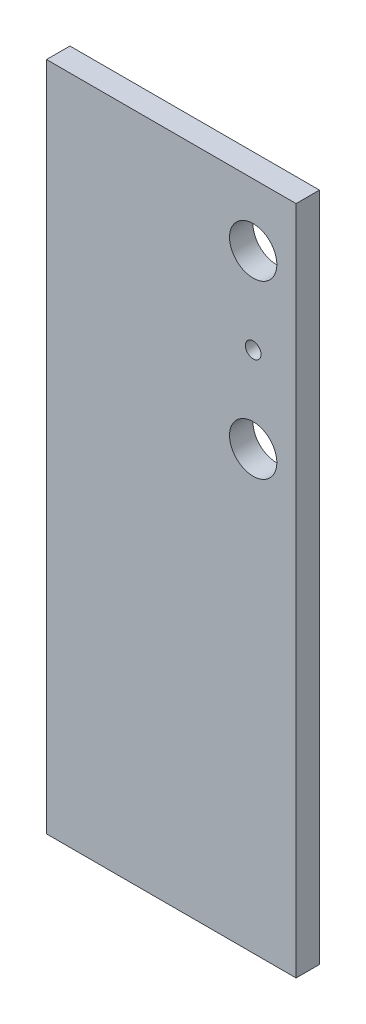
ISO-10303-21;
HEADER;
FILE_DESCRIPTION(('STEP AP214'),'2;1');
FILE_NAME('part.step','',(''),(''),'','','');
FILE_SCHEMA(('AUTOMOTIVE_DESIGN { 1 0 10303 214 1 1 1 1 }'));
ENDSEC;
DATA;
#1=APPLICATION_CONTEXT('core data for automotive mechanical design processes');
#2=APPLICATION_PROTOCOL_DEFINITION('international standard','automotive_design',2000,#1);
#3=PRODUCT_CONTEXT('',#1,'mechanical');
#4=PRODUCT('Part','Part','',(#3));
#5=PRODUCT_RELATED_PRODUCT_CATEGORY('part','',(#4));
#6=PRODUCT_DEFINITION_FORMATION('','',#4);
#7=PRODUCT_DEFINITION_CONTEXT('part definition',#1,'design');
#8=PRODUCT_DEFINITION('design','',#6,#7);
#9=PRODUCT_DEFINITION_SHAPE('','',#8);
#10=(LENGTH_UNIT() NAMED_UNIT(*) SI_UNIT(.MILLI.,.METRE.));
#11=(NAMED_UNIT(*) PLANE_ANGLE_UNIT() SI_UNIT($,.RADIAN.));
#12=(NAMED_UNIT(*) SI_UNIT($,.STERADIAN.) SOLID_ANGLE_UNIT());
#13=UNCERTAINTY_MEASURE_WITH_UNIT(LENGTH_MEASURE(1.E-05),#10,'distance_accuracy_value','');
#14=(GEOMETRIC_REPRESENTATION_CONTEXT(3) GLOBAL_UNCERTAINTY_ASSIGNED_CONTEXT((#13)) GLOBAL_UNIT_ASSIGNED_CONTEXT((#10,
#11,#12)) REPRESENTATION_CONTEXT('',''));
#15=CARTESIAN_POINT('',(0.,0.,0.));
#16=DIRECTION('',(0.,0.,1.));
#17=DIRECTION('',(1.,0.,0.));
#18=AXIS2_PLACEMENT_3D('',#15,#16,#17);
#19=CARTESIAN_POINT('',(0.,0.,19.05));
#20=DIRECTION('',(1.,0.,0.));
#21=DIRECTION('',(0.,0.,-1.));
#22=AXIS2_PLACEMENT_3D('',#19,#20,#21);
#23=PLANE('',#22);
#24=DIRECTION('',(0.,-1.,0.));
#25=VECTOR('',#24,1.);
#26=CARTESIAN_POINT('',(0.,0.,0.));
#27=LINE('',#26,#25);
#28=CARTESIAN_POINT('',(0.,546.1,0.));
#29=VERTEX_POINT('',#28);
#30=CARTESIAN_POINT('',(0.,0.,0.));
#31=VERTEX_POINT('',#30);
#32=EDGE_CURVE('E95',#29,#31,#27,.T.);
#33=ORIENTED_EDGE('',*,*,#32,.T.);
#34=DIRECTION('',(0.,0.,-1.));
#35=VECTOR('',#34,1.);
#36=CARTESIAN_POINT('',(0.,0.,19.05));
#37=LINE('',#36,#35);
#38=CARTESIAN_POINT('',(0.,0.,19.05));
#39=VERTEX_POINT('',#38);
#40=EDGE_CURVE('E11',#39,#31,#37,.T.);
#41=ORIENTED_EDGE('',*,*,#40,.F.);
#42=DIRECTION('',(0.,-1.,0.));
#43=VECTOR('',#42,1.);
#44=CARTESIAN_POINT('',(0.,0.,19.05));
#45=LINE('',#44,#43);
#46=CARTESIAN_POINT('',(0.,546.1,19.05));
#47=VERTEX_POINT('',#46);
#48=EDGE_CURVE('E83',#47,#39,#45,.T.);
#49=ORIENTED_EDGE('',*,*,#48,.F.);
#50=DIRECTION('',(0.,0.,-1.));
#51=VECTOR('',#50,1.);
#52=CARTESIAN_POINT('',(0.,546.1,19.05));
#53=LINE('',#52,#51);
#54=EDGE_CURVE('E91',#47,#29,#53,.T.);
#55=ORIENTED_EDGE('',*,*,#54,.T.);
#56=EDGE_LOOP('',(#33,#41,#49,#55));
#57=FACE_BOUND('',#56,.T.);
#58=ADVANCED_FACE('F32',(#57),#23,.F.);
#59=CARTESIAN_POINT('',(0.,0.,19.05));
#60=DIRECTION('',(0.,1.,0.));
#61=DIRECTION('',(0.,0.,1.));
#62=AXIS2_PLACEMENT_3D('',#59,#60,#61);
#63=PLANE('',#62);
#64=DIRECTION('',(1.,0.,0.));
#65=VECTOR('',#64,1.);
#66=CARTESIAN_POINT('',(0.,0.,0.));
#67=LINE('',#66,#65);
#68=CARTESIAN_POINT('',(203.2,0.,0.));
#69=VERTEX_POINT('',#68);
#70=EDGE_CURVE('E87',#31,#69,#67,.T.);
#71=ORIENTED_EDGE('',*,*,#70,.T.);
#72=DIRECTION('',(0.,0.,-1.));
#73=VECTOR('',#72,1.);
#74=CARTESIAN_POINT('',(203.2,0.,19.05));
#75=LINE('',#74,#73);
#76=CARTESIAN_POINT('',(203.2,0.,19.05));
#77=VERTEX_POINT('',#76);
#78=EDGE_CURVE('E40',#77,#69,#75,.T.);
#79=ORIENTED_EDGE('',*,*,#78,.F.);
#80=DIRECTION('',(1.,0.,0.));
#81=VECTOR('',#80,1.);
#82=CARTESIAN_POINT('',(0.,0.,19.05));
#83=LINE('',#82,#81);
#84=EDGE_CURVE('E78',#39,#77,#83,.T.);
#85=ORIENTED_EDGE('',*,*,#84,.F.);
#86=ORIENTED_EDGE('',*,*,#40,.T.);
#87=EDGE_LOOP('',(#71,#79,#85,#86));
#88=FACE_BOUND('',#87,.T.);
#89=ADVANCED_FACE('F86',(#88),#63,.F.);
#90=CARTESIAN_POINT('',(203.2,0.,19.05));
#91=DIRECTION('',(-1.,0.,0.));
#92=DIRECTION('',(0.,0.,1.));
#93=AXIS2_PLACEMENT_3D('',#90,#91,#92);
#94=PLANE('',#93);
#95=DIRECTION('',(0.,1.,0.));
#96=VECTOR('',#95,1.);
#97=CARTESIAN_POINT('',(203.2,0.,0.));
#98=LINE('',#97,#96);
#99=CARTESIAN_POINT('',(203.2,546.1,0.));
#100=VERTEX_POINT('',#99);
#101=EDGE_CURVE('E65',#69,#100,#98,.T.);
#102=ORIENTED_EDGE('',*,*,#101,.T.);
#103=DIRECTION('',(0.,0.,-1.));
#104=VECTOR('',#103,1.);
#105=CARTESIAN_POINT('',(203.2,546.1,19.05));
#106=LINE('',#105,#104);
#107=CARTESIAN_POINT('',(203.2,546.1,19.05));
#108=VERTEX_POINT('',#107);
#109=EDGE_CURVE('E88',#108,#100,#106,.T.);
#110=ORIENTED_EDGE('',*,*,#109,.F.);
#111=DIRECTION('',(0.,1.,0.));
#112=VECTOR('',#111,1.);
#113=CARTESIAN_POINT('',(203.2,0.,19.05));
#114=LINE('',#113,#112);
#115=EDGE_CURVE('E81',#77,#108,#114,.T.);
#116=ORIENTED_EDGE('',*,*,#115,.F.);
#117=ORIENTED_EDGE('',*,*,#78,.T.);
#118=EDGE_LOOP('',(#102,#110,#116,#117));
#119=FACE_BOUND('',#118,.T.);
#120=ADVANCED_FACE('F89',(#119),#94,.F.);
#121=CARTESIAN_POINT('',(0.,546.1,19.05));
#122=DIRECTION('',(0.,-1.,0.));
#123=DIRECTION('',(0.,0.,-1.));
#124=AXIS2_PLACEMENT_3D('',#121,#122,#123);
#125=PLANE('',#124);
#126=DIRECTION('',(-1.,0.,0.));
#127=VECTOR('',#126,1.);
#128=CARTESIAN_POINT('',(0.,546.1,0.));
#129=LINE('',#128,#127);
#130=EDGE_CURVE('E71',#100,#29,#129,.T.);
#131=ORIENTED_EDGE('',*,*,#130,.T.);
#132=ORIENTED_EDGE('',*,*,#54,.F.);
#133=DIRECTION('',(-1.,0.,0.));
#134=VECTOR('',#133,1.);
#135=CARTESIAN_POINT('',(0.,546.1,19.05));
#136=LINE('',#135,#134);
#137=EDGE_CURVE('E48',#108,#47,#136,.T.);
#138=ORIENTED_EDGE('',*,*,#137,.F.);
#139=ORIENTED_EDGE('',*,*,#109,.T.);
#140=EDGE_LOOP('',(#131,#132,#138,#139));
#141=FACE_BOUND('',#140,.T.);
#142=ADVANCED_FACE('F103',(#141),#125,.F.);
#143=CARTESIAN_POINT('',(0.,546.1,19.05));
#144=DIRECTION('',(0.,0.,-1.));
#145=DIRECTION('',(-1.,0.,0.));
#146=AXIS2_PLACEMENT_3D('',#143,#144,#145);
#147=PLANE('',#146);
#148=CARTESIAN_POINT('',(168.275,425.45,19.05));
#149=DIRECTION('',(0.,0.,-1.));
#150=DIRECTION('',(-1.,0.,0.));
#151=AXIS2_PLACEMENT_3D('',#148,#149,#150);
#152=CIRCLE('',#151,6.34999999999999);
#153=CARTESIAN_POINT('',(161.925,425.45,19.05));
#154=VERTEX_POINT('',#153);
#155=EDGE_CURVE('E124',#154,#154,#152,.T.);
#156=ORIENTED_EDGE('',*,*,#155,.T.);
#157=EDGE_LOOP('',(#156));
#158=FACE_BOUND('',#157,.T.);
#159=CARTESIAN_POINT('',(168.275,355.6,19.05));
#160=DIRECTION('',(0.,0.,-1.));
#161=DIRECTION('',(-1.,0.,0.));
#162=AXIS2_PLACEMENT_3D('',#159,#160,#161);
#163=CIRCLE('',#162,19.2405);
#164=CARTESIAN_POINT('',(149.0345,355.6,19.05));
#165=VERTEX_POINT('',#164);
#166=EDGE_CURVE('E112',#165,#165,#163,.T.);
#167=ORIENTED_EDGE('',*,*,#166,.T.);
#168=EDGE_LOOP('',(#167));
#169=FACE_BOUND('',#168,.T.);
#170=CARTESIAN_POINT('',(168.275,495.3,19.05));
#171=DIRECTION('',(0.,0.,-1.));
#172=DIRECTION('',(-1.,0.,0.));
#173=AXIS2_PLACEMENT_3D('',#170,#171,#172);
#174=CIRCLE('',#173,19.2405);
#175=CARTESIAN_POINT('',(149.0345,495.3,19.05));
#176=VERTEX_POINT('',#175);
#177=EDGE_CURVE('E98',#176,#176,#174,.T.);
#178=ORIENTED_EDGE('',*,*,#177,.T.);
#179=EDGE_LOOP('',(#178));
#180=FACE_BOUND('',#179,.T.);
#181=ORIENTED_EDGE('',*,*,#48,.T.);
#182=ORIENTED_EDGE('',*,*,#84,.T.);
#183=ORIENTED_EDGE('',*,*,#115,.T.);
#184=ORIENTED_EDGE('',*,*,#137,.T.);
#185=EDGE_LOOP('',(#181,#182,#183,#184));
#186=FACE_BOUND('',#185,.T.);
#187=ADVANCED_FACE('F79',(#158,#169,#180,#186),#147,.F.);
#188=CARTESIAN_POINT('',(0.,546.1,0.));
#189=DIRECTION('',(0.,0.,-1.));
#190=DIRECTION('',(-1.,0.,0.));
#191=AXIS2_PLACEMENT_3D('',#188,#189,#190);
#192=PLANE('',#191);
#193=CARTESIAN_POINT('',(168.275,425.45,0.));
#194=DIRECTION('',(0.,0.,-1.));
#195=DIRECTION('',(-1.,0.,0.));
#196=AXIS2_PLACEMENT_3D('',#193,#194,#195);
#197=CIRCLE('',#196,10.9982);
#198=CARTESIAN_POINT('',(157.2768,425.45,0.));
#199=VERTEX_POINT('',#198);
#200=EDGE_CURVE('E121',#199,#199,#197,.T.);
#201=ORIENTED_EDGE('',*,*,#200,.F.);
#202=EDGE_LOOP('',(#201));
#203=FACE_BOUND('',#202,.T.);
#204=CARTESIAN_POINT('',(168.275,355.6,0.));
#205=DIRECTION('',(0.,0.,-1.));
#206=DIRECTION('',(-1.,0.,0.));
#207=AXIS2_PLACEMENT_3D('',#204,#205,#206);
#208=CIRCLE('',#207,19.2405);
#209=CARTESIAN_POINT('',(149.0345,355.6,0.));
#210=VERTEX_POINT('',#209);
#211=EDGE_CURVE('E115',#210,#210,#208,.T.);
#212=ORIENTED_EDGE('',*,*,#211,.F.);
#213=EDGE_LOOP('',(#212));
#214=FACE_BOUND('',#213,.T.);
#215=CARTESIAN_POINT('',(168.275,495.3,0.));
#216=DIRECTION('',(0.,0.,-1.));
#217=DIRECTION('',(-1.,0.,0.));
#218=AXIS2_PLACEMENT_3D('',#215,#216,#217);
#219=CIRCLE('',#218,19.2405);
#220=CARTESIAN_POINT('',(149.0345,495.3,0.));
#221=VERTEX_POINT('',#220);
#222=EDGE_CURVE('E109',#221,#221,#219,.T.);
#223=ORIENTED_EDGE('',*,*,#222,.F.);
#224=EDGE_LOOP('',(#223));
#225=FACE_BOUND('',#224,.T.);
#226=ORIENTED_EDGE('',*,*,#32,.F.);
#227=ORIENTED_EDGE('',*,*,#130,.F.);
#228=ORIENTED_EDGE('',*,*,#101,.F.);
#229=ORIENTED_EDGE('',*,*,#70,.F.);
#230=EDGE_LOOP('',(#226,#227,#228,#229));
#231=FACE_BOUND('',#230,.T.);
#232=ADVANCED_FACE('F106',(#203,#214,#225,#231),#192,.T.);
#233=CARTESIAN_POINT('',(168.275,495.3,19.05));
#234=DIRECTION('',(0.,0.,-1.));
#235=DIRECTION('',(-1.,0.,0.));
#236=AXIS2_PLACEMENT_3D('',#233,#234,#235);
#237=CYLINDRICAL_SURFACE('',#236,19.2405);
#238=CARTESIAN_POINT('',(149.0345,495.3,19.05));
#239=CARTESIAN_POINT('',(149.0345,495.3,18.8515625));
#240=CARTESIAN_POINT('',(149.0345,495.3,18.653125));
#241=CARTESIAN_POINT('',(149.0345,495.3,18.25625));
#242=CARTESIAN_POINT('',(149.0345,495.3,18.0578125));
#243=CARTESIAN_POINT('',(149.0345,495.3,17.6609375));
#244=CARTESIAN_POINT('',(149.0345,495.3,17.4625));
#245=CARTESIAN_POINT('',(149.0345,495.3,17.065625));
#246=CARTESIAN_POINT('',(149.0345,495.3,16.8671875));
#247=CARTESIAN_POINT('',(149.0345,495.3,16.4703125));
#248=CARTESIAN_POINT('',(149.0345,495.3,16.271875));
#249=CARTESIAN_POINT('',(149.0345,495.3,15.875));
#250=CARTESIAN_POINT('',(149.0345,495.3,15.6765625));
#251=CARTESIAN_POINT('',(149.0345,495.3,15.2796875));
#252=CARTESIAN_POINT('',(149.0345,495.3,15.08125));
#253=CARTESIAN_POINT('',(149.0345,495.3,14.684375));
#254=CARTESIAN_POINT('',(149.0345,495.3,14.4859375));
#255=CARTESIAN_POINT('',(149.0345,495.3,14.0890625));
#256=CARTESIAN_POINT('',(149.0345,495.3,13.890625));
#257=CARTESIAN_POINT('',(149.0345,495.3,13.49375));
#258=CARTESIAN_POINT('',(149.0345,495.3,13.2953125));
#259=CARTESIAN_POINT('',(149.0345,495.3,12.8984375));
#260=CARTESIAN_POINT('',(149.0345,495.3,12.7));
#261=CARTESIAN_POINT('',(149.0345,495.3,12.303125));
#262=CARTESIAN_POINT('',(149.0345,495.3,12.1046875));
#263=CARTESIAN_POINT('',(149.0345,495.3,11.7078125));
#264=CARTESIAN_POINT('',(149.0345,495.3,11.509375));
#265=CARTESIAN_POINT('',(149.0345,495.3,11.1125));
#266=CARTESIAN_POINT('',(149.0345,495.3,10.9140625));
#267=CARTESIAN_POINT('',(149.0345,495.3,10.5171875));
#268=CARTESIAN_POINT('',(149.0345,495.3,10.31875));
#269=CARTESIAN_POINT('',(149.0345,495.3,9.921875));
#270=CARTESIAN_POINT('',(149.0345,495.3,9.7234375));
#271=CARTESIAN_POINT('',(149.0345,495.3,9.3265625));
#272=CARTESIAN_POINT('',(149.0345,495.3,9.128125));
#273=CARTESIAN_POINT('',(149.0345,495.3,8.73125));
#274=CARTESIAN_POINT('',(149.0345,495.3,8.5328125));
#275=CARTESIAN_POINT('',(149.0345,495.3,8.1359375));
#276=CARTESIAN_POINT('',(149.0345,495.3,7.9375));
#277=CARTESIAN_POINT('',(149.0345,495.3,7.540625));
#278=CARTESIAN_POINT('',(149.0345,495.3,7.3421875));
#279=CARTESIAN_POINT('',(149.0345,495.3,6.9453125));
#280=CARTESIAN_POINT('',(149.0345,495.3,6.746875));
#281=CARTESIAN_POINT('',(149.0345,495.3,6.35));
#282=CARTESIAN_POINT('',(149.0345,495.3,6.1515625));
#283=CARTESIAN_POINT('',(149.0345,495.3,5.7546875));
#284=CARTESIAN_POINT('',(149.0345,495.3,5.55625));
#285=CARTESIAN_POINT('',(149.0345,495.3,5.159375));
#286=CARTESIAN_POINT('',(149.0345,495.3,4.9609375));
#287=CARTESIAN_POINT('',(149.0345,495.3,4.5640625));
#288=CARTESIAN_POINT('',(149.0345,495.3,4.365625));
#289=CARTESIAN_POINT('',(149.0345,495.3,3.96875));
#290=CARTESIAN_POINT('',(149.0345,495.3,3.7703125));
#291=CARTESIAN_POINT('',(149.0345,495.3,3.3734375));
#292=CARTESIAN_POINT('',(149.0345,495.3,3.175));
#293=CARTESIAN_POINT('',(149.0345,495.3,2.778125));
#294=CARTESIAN_POINT('',(149.0345,495.3,2.5796875));
#295=CARTESIAN_POINT('',(149.0345,495.3,2.1828125));
#296=CARTESIAN_POINT('',(149.0345,495.3,1.984375));
#297=CARTESIAN_POINT('',(149.0345,495.3,1.5875));
#298=CARTESIAN_POINT('',(149.0345,495.3,1.3890625));
#299=CARTESIAN_POINT('',(149.0345,495.3,0.992187500000001));
#300=CARTESIAN_POINT('',(149.0345,495.3,0.793750000000001));
#301=CARTESIAN_POINT('',(149.0345,495.3,0.396875));
#302=CARTESIAN_POINT('',(149.0345,495.3,0.1984375));
#303=CARTESIAN_POINT('',(149.0345,495.3,0.));
#304=B_SPLINE_CURVE_WITH_KNOTS('',3,(#238,#239,#240,#241,#242,#243,#244,#245,#246,#247,#248,
#249,#250,#251,#252,#253,#254,#255,#256,#257,#258,#259,#260,#261,#262,#263,#264,#265,#266,#267,
#268,#269,#270,#271,#272,#273,#274,#275,#276,#277,#278,#279,#280,#281,#282,#283,#284,#285,#286,
#287,#288,#289,#290,#291,#292,#293,#294,#295,#296,#297,#298,#299,#300,#301,#302,#303),
.UNSPECIFIED.,.F.,.F.,(4,2,2,2,2,2,2,2,2,2,2,2,2,2,2,2,2,2,2,2,2,2,2,2,2,2,2,2,2,2,2,2,4),(0.,
0.595312499999997,1.190625,1.7859375,2.38125,2.9765625,3.571875,4.1671875,4.7625,5.3578125,
5.953125,6.5484375,7.14375,7.7390625,8.334375,8.9296875,9.525,10.1203125,10.715625,11.3109375,
11.90625,12.5015625,13.096875,13.6921875,14.2875,14.8828125,15.478125,16.0734375,16.66875,
17.2640625,17.859375,18.4546875,19.05),.UNSPECIFIED.);
#305=EDGE_CURVE('BSEAM156',#176,#221,#304,.T.);
#306=ORIENTED_EDGE('',*,*,#177,.F.);
#307=ORIENTED_EDGE('',*,*,#222,.T.);
#308=ORIENTED_EDGE('',*,*,#305,.T.);
#309=ORIENTED_EDGE('',*,*,#305,.F.);
#310=EDGE_LOOP('',(#306,#308,#307,#309));
#311=FACE_BOUND('',#310,.T.);
#312=ADVANCED_FACE('F156',(#311),#237,.F.);
#313=CARTESIAN_POINT('',(168.275,355.6,19.05));
#314=DIRECTION('',(0.,0.,-1.));
#315=DIRECTION('',(-1.,0.,0.));
#316=AXIS2_PLACEMENT_3D('',#313,#314,#315);
#317=CYLINDRICAL_SURFACE('',#316,19.2405);
#318=CARTESIAN_POINT('',(149.0345,355.6,19.05));
#319=CARTESIAN_POINT('',(149.0345,355.6,18.8515625));
#320=CARTESIAN_POINT('',(149.0345,355.6,18.653125));
#321=CARTESIAN_POINT('',(149.0345,355.6,18.25625));
#322=CARTESIAN_POINT('',(149.0345,355.6,18.0578125));
#323=CARTESIAN_POINT('',(149.0345,355.6,17.6609375));
#324=CARTESIAN_POINT('',(149.0345,355.6,17.4625));
#325=CARTESIAN_POINT('',(149.0345,355.6,17.065625));
#326=CARTESIAN_POINT('',(149.0345,355.6,16.8671875));
#327=CARTESIAN_POINT('',(149.0345,355.6,16.4703125));
#328=CARTESIAN_POINT('',(149.0345,355.6,16.271875));
#329=CARTESIAN_POINT('',(149.0345,355.6,15.875));
#330=CARTESIAN_POINT('',(149.0345,355.6,15.6765625));
#331=CARTESIAN_POINT('',(149.0345,355.6,15.2796875));
#332=CARTESIAN_POINT('',(149.0345,355.6,15.08125));
#333=CARTESIAN_POINT('',(149.0345,355.6,14.684375));
#334=CARTESIAN_POINT('',(149.0345,355.6,14.4859375));
#335=CARTESIAN_POINT('',(149.0345,355.6,14.0890625));
#336=CARTESIAN_POINT('',(149.0345,355.6,13.890625));
#337=CARTESIAN_POINT('',(149.0345,355.6,13.49375));
#338=CARTESIAN_POINT('',(149.0345,355.6,13.2953125));
#339=CARTESIAN_POINT('',(149.0345,355.6,12.8984375));
#340=CARTESIAN_POINT('',(149.0345,355.6,12.7));
#341=CARTESIAN_POINT('',(149.0345,355.6,12.303125));
#342=CARTESIAN_POINT('',(149.0345,355.6,12.1046875));
#343=CARTESIAN_POINT('',(149.0345,355.6,11.7078125));
#344=CARTESIAN_POINT('',(149.0345,355.6,11.509375));
#345=CARTESIAN_POINT('',(149.0345,355.6,11.1125));
#346=CARTESIAN_POINT('',(149.0345,355.6,10.9140625));
#347=CARTESIAN_POINT('',(149.0345,355.6,10.5171875));
#348=CARTESIAN_POINT('',(149.0345,355.6,10.31875));
#349=CARTESIAN_POINT('',(149.0345,355.6,9.921875));
#350=CARTESIAN_POINT('',(149.0345,355.6,9.7234375));
#351=CARTESIAN_POINT('',(149.0345,355.6,9.3265625));
#352=CARTESIAN_POINT('',(149.0345,355.6,9.128125));
#353=CARTESIAN_POINT('',(149.0345,355.6,8.73125));
#354=CARTESIAN_POINT('',(149.0345,355.6,8.5328125));
#355=CARTESIAN_POINT('',(149.0345,355.6,8.1359375));
#356=CARTESIAN_POINT('',(149.0345,355.6,7.9375));
#357=CARTESIAN_POINT('',(149.0345,355.6,7.540625));
#358=CARTESIAN_POINT('',(149.0345,355.6,7.3421875));
#359=CARTESIAN_POINT('',(149.0345,355.6,6.9453125));
#360=CARTESIAN_POINT('',(149.0345,355.6,6.746875));
#361=CARTESIAN_POINT('',(149.0345,355.6,6.35));
#362=CARTESIAN_POINT('',(149.0345,355.6,6.1515625));
#363=CARTESIAN_POINT('',(149.0345,355.6,5.7546875));
#364=CARTESIAN_POINT('',(149.0345,355.6,5.55625));
#365=CARTESIAN_POINT('',(149.0345,355.6,5.159375));
#366=CARTESIAN_POINT('',(149.0345,355.6,4.9609375));
#367=CARTESIAN_POINT('',(149.0345,355.6,4.5640625));
#368=CARTESIAN_POINT('',(149.0345,355.6,4.365625));
#369=CARTESIAN_POINT('',(149.0345,355.6,3.96875));
#370=CARTESIAN_POINT('',(149.0345,355.6,3.7703125));
#371=CARTESIAN_POINT('',(149.0345,355.6,3.3734375));
#372=CARTESIAN_POINT('',(149.0345,355.6,3.175));
#373=CARTESIAN_POINT('',(149.0345,355.6,2.778125));
#374=CARTESIAN_POINT('',(149.0345,355.6,2.5796875));
#375=CARTESIAN_POINT('',(149.0345,355.6,2.1828125));
#376=CARTESIAN_POINT('',(149.0345,355.6,1.984375));
#377=CARTESIAN_POINT('',(149.0345,355.6,1.5875));
#378=CARTESIAN_POINT('',(149.0345,355.6,1.3890625));
#379=CARTESIAN_POINT('',(149.0345,355.6,0.992187500000001));
#380=CARTESIAN_POINT('',(149.0345,355.6,0.793750000000001));
#381=CARTESIAN_POINT('',(149.0345,355.6,0.396875));
#382=CARTESIAN_POINT('',(149.0345,355.6,0.1984375));
#383=CARTESIAN_POINT('',(149.0345,355.6,0.));
#384=B_SPLINE_CURVE_WITH_KNOTS('',3,(#318,#319,#320,#321,#322,#323,#324,#325,#326,#327,#328,
#329,#330,#331,#332,#333,#334,#335,#336,#337,#338,#339,#340,#341,#342,#343,#344,#345,#346,#347,
#348,#349,#350,#351,#352,#353,#354,#355,#356,#357,#358,#359,#360,#361,#362,#363,#364,#365,#366,
#367,#368,#369,#370,#371,#372,#373,#374,#375,#376,#377,#378,#379,#380,#381,#382,#383),
.UNSPECIFIED.,.F.,.F.,(4,2,2,2,2,2,2,2,2,2,2,2,2,2,2,2,2,2,2,2,2,2,2,2,2,2,2,2,2,2,2,2,4),(0.,
0.595312499999997,1.190625,1.7859375,2.38125,2.9765625,3.571875,4.1671875,4.7625,5.3578125,
5.953125,6.5484375,7.14375,7.7390625,8.334375,8.9296875,9.525,10.1203125,10.715625,11.3109375,
11.90625,12.5015625,13.096875,13.6921875,14.2875,14.8828125,15.478125,16.0734375,16.66875,
17.2640625,17.859375,18.4546875,19.05),.UNSPECIFIED.);
#385=EDGE_CURVE('BSEAM150',#165,#210,#384,.T.);
#386=ORIENTED_EDGE('',*,*,#166,.F.);
#387=ORIENTED_EDGE('',*,*,#211,.T.);
#388=ORIENTED_EDGE('',*,*,#385,.T.);
#389=ORIENTED_EDGE('',*,*,#385,.F.);
#390=EDGE_LOOP('',(#386,#388,#387,#389));
#391=FACE_BOUND('',#390,.T.);
#392=ADVANCED_FACE('F150',(#391),#317,.F.);
#393=CARTESIAN_POINT('',(168.275,425.45,6.985));
#394=DIRECTION('',(0.,0.,-1.));
#395=DIRECTION('',(-1.,0.,0.));
#396=AXIS2_PLACEMENT_3D('',#393,#394,#395);
#397=CYLINDRICAL_SURFACE('',#396,10.9982);
#398=CARTESIAN_POINT('',(168.275,425.45,6.985));
#399=DIRECTION('',(0.,0.,-1.));
#400=DIRECTION('',(-1.,0.,0.));
#401=AXIS2_PLACEMENT_3D('',#398,#399,#400);
#402=CIRCLE('',#401,10.9982);
#403=CARTESIAN_POINT('',(157.2768,425.45,6.985));
#404=VERTEX_POINT('',#403);
#405=EDGE_CURVE('E118',#404,#404,#402,.T.);
#406=ORIENTED_EDGE('',*,*,#405,.F.);
#407=EDGE_LOOP('',(#406));
#408=FACE_BOUND('',#407,.T.);
#409=ORIENTED_EDGE('',*,*,#200,.T.);
#410=EDGE_LOOP('',(#409));
#411=FACE_BOUND('',#410,.T.);
#412=ADVANCED_FACE('F144',(#408,#411),#397,.F.);
#413=CARTESIAN_POINT('',(168.275,425.45,6.985));
#414=DIRECTION('',(0.,0.,-1.));
#415=DIRECTION('',(-1.,0.,0.));
#416=AXIS2_PLACEMENT_3D('',#413,#414,#415);
#417=PLANE('',#416);
#418=CARTESIAN_POINT('',(168.275,425.45,6.985));
#419=DIRECTION('',(0.,0.,-1.));
#420=DIRECTION('',(-1.,0.,0.));
#421=AXIS2_PLACEMENT_3D('',#418,#419,#420);
#422=CIRCLE('',#421,6.34999999999999);
#423=CARTESIAN_POINT('',(161.925,425.45,6.985));
#424=VERTEX_POINT('',#423);
#425=EDGE_CURVE('E127',#424,#424,#422,.T.);
#426=ORIENTED_EDGE('',*,*,#425,.F.);
#427=EDGE_LOOP('',(#426));
#428=FACE_BOUND('',#427,.T.);
#429=ORIENTED_EDGE('',*,*,#405,.T.);
#430=EDGE_LOOP('',(#429));
#431=FACE_BOUND('',#430,.T.);
#432=ADVANCED_FACE('F138',(#428,#431),#417,.T.);
#433=CARTESIAN_POINT('',(168.275,425.45,19.05));
#434=DIRECTION('',(0.,0.,-1.));
#435=DIRECTION('',(-1.,0.,0.));
#436=AXIS2_PLACEMENT_3D('',#433,#434,#435);
#437=CYLINDRICAL_SURFACE('',#436,6.34999999999999);
#438=CARTESIAN_POINT('',(161.925,425.45,19.05));
#439=CARTESIAN_POINT('',(161.925,425.45,18.9243229166667));
#440=CARTESIAN_POINT('',(161.925,425.45,18.7986458333333));
#441=CARTESIAN_POINT('',(161.925,425.45,18.5472916666667));
#442=CARTESIAN_POINT('',(161.925,425.45,18.4216145833333));
#443=CARTESIAN_POINT('',(161.925,425.45,18.1702604166667));
#444=CARTESIAN_POINT('',(161.925,425.45,18.0445833333333));
#445=CARTESIAN_POINT('',(161.925,425.45,17.7932291666667));
#446=CARTESIAN_POINT('',(161.925,425.45,17.6675520833333));
#447=CARTESIAN_POINT('',(161.925,425.45,17.4161979166667));
#448=CARTESIAN_POINT('',(161.925,425.45,17.2905208333333));
#449=CARTESIAN_POINT('',(161.925,425.45,17.0391666666667));
#450=CARTESIAN_POINT('',(161.925,425.45,16.9134895833333));
#451=CARTESIAN_POINT('',(161.925,425.45,16.6621354166667));
#452=CARTESIAN_POINT('',(161.925,425.45,16.5364583333333));
#453=CARTESIAN_POINT('',(161.925,425.45,16.2851041666667));
#454=CARTESIAN_POINT('',(161.925,425.45,16.1594270833333));
#455=CARTESIAN_POINT('',(161.925,425.45,15.9080729166667));
#456=CARTESIAN_POINT('',(161.925,425.45,15.7823958333333));
#457=CARTESIAN_POINT('',(161.925,425.45,15.5310416666667));
#458=CARTESIAN_POINT('',(161.925,425.45,15.4053645833333));
#459=CARTESIAN_POINT('',(161.925,425.45,15.1540104166667));
#460=CARTESIAN_POINT('',(161.925,425.45,15.0283333333333));
#461=CARTESIAN_POINT('',(161.925,425.45,14.7769791666667));
#462=CARTESIAN_POINT('',(161.925,425.45,14.6513020833333));
#463=CARTESIAN_POINT('',(161.925,425.45,14.3999479166667));
#464=CARTESIAN_POINT('',(161.925,425.45,14.2742708333333));
#465=CARTESIAN_POINT('',(161.925,425.45,14.0229166666667));
#466=CARTESIAN_POINT('',(161.925,425.45,13.8972395833333));
#467=CARTESIAN_POINT('',(161.925,425.45,13.6458854166667));
#468=CARTESIAN_POINT('',(161.925,425.45,13.5202083333333));
#469=CARTESIAN_POINT('',(161.925,425.45,13.2688541666667));
#470=CARTESIAN_POINT('',(161.925,425.45,13.1431770833333));
#471=CARTESIAN_POINT('',(161.925,425.45,12.8918229166667));
#472=CARTESIAN_POINT('',(161.925,425.45,12.7661458333333));
#473=CARTESIAN_POINT('',(161.925,425.45,12.5147916666667));
#474=CARTESIAN_POINT('',(161.925,425.45,12.3891145833333));
#475=CARTESIAN_POINT('',(161.925,425.45,12.1377604166667));
#476=CARTESIAN_POINT('',(161.925,425.45,12.0120833333333));
#477=CARTESIAN_POINT('',(161.925,425.45,11.7607291666667));
#478=CARTESIAN_POINT('',(161.925,425.45,11.6350520833333));
#479=CARTESIAN_POINT('',(161.925,425.45,11.3836979166667));
#480=CARTESIAN_POINT('',(161.925,425.45,11.2580208333333));
#481=CARTESIAN_POINT('',(161.925,425.45,11.0066666666667));
#482=CARTESIAN_POINT('',(161.925,425.45,10.8809895833333));
#483=CARTESIAN_POINT('',(161.925,425.45,10.6296354166667));
#484=CARTESIAN_POINT('',(161.925,425.45,10.5039583333333));
#485=CARTESIAN_POINT('',(161.925,425.45,10.2526041666667));
#486=CARTESIAN_POINT('',(161.925,425.45,10.1269270833333));
#487=CARTESIAN_POINT('',(161.925,425.45,9.87557291666667));
#488=CARTESIAN_POINT('',(161.925,425.45,9.74989583333334));
#489=CARTESIAN_POINT('',(161.925,425.45,9.49854166666667));
#490=CARTESIAN_POINT('',(161.925,425.45,9.37286458333334));
#491=CARTESIAN_POINT('',(161.925,425.45,9.12151041666667));
#492=CARTESIAN_POINT('',(161.925,425.45,8.99583333333333));
#493=CARTESIAN_POINT('',(161.925,425.45,8.74447916666667));
#494=CARTESIAN_POINT('',(161.925,425.45,8.61880208333333));
#495=CARTESIAN_POINT('',(161.925,425.45,8.36744791666667));
#496=CARTESIAN_POINT('',(161.925,425.45,8.24177083333333));
#497=CARTESIAN_POINT('',(161.925,425.45,7.99041666666667));
#498=CARTESIAN_POINT('',(161.925,425.45,7.86473958333333));
#499=CARTESIAN_POINT('',(161.925,425.45,7.61338541666667));
#500=CARTESIAN_POINT('',(161.925,425.45,7.48770833333333));
#501=CARTESIAN_POINT('',(161.925,425.45,7.23635416666667));
#502=CARTESIAN_POINT('',(161.925,425.45,7.11067708333333));
#503=CARTESIAN_POINT('',(161.925,425.45,6.985));
#504=B_SPLINE_CURVE_WITH_KNOTS('',3,(#438,#439,#440,#441,#442,#443,#444,#445,#446,#447,#448,
#449,#450,#451,#452,#453,#454,#455,#456,#457,#458,#459,#460,#461,#462,#463,#464,#465,#466,#467,
#468,#469,#470,#471,#472,#473,#474,#475,#476,#477,#478,#479,#480,#481,#482,#483,#484,#485,#486,
#487,#488,#489,#490,#491,#492,#493,#494,#495,#496,#497,#498,#499,#500,#501,#502,#503),
.UNSPECIFIED.,.F.,.F.,(4,2,2,2,2,2,2,2,2,2,2,2,2,2,2,2,2,2,2,2,2,2,2,2,2,2,2,2,2,2,2,2,4),(0.,
0.377031250000003,0.754062500000003,1.13109375,1.508125,1.88515625,2.2621875,2.63921875,3.01625,
3.39328125,3.7703125,4.14734375,4.524375,4.90140625,5.2784375,5.65546875,6.0325,6.40953125,
6.7865625,7.16359375,7.540625,7.91765625,8.2946875,8.67171875,9.04875,9.42578125,9.8028125,
10.17984375,10.556875,10.93390625,11.3109375,11.68796875,12.065),.UNSPECIFIED.);
#505=EDGE_CURVE('BSEAM135',#154,#424,#504,.T.);
#506=ORIENTED_EDGE('',*,*,#155,.F.);
#507=ORIENTED_EDGE('',*,*,#425,.T.);
#508=ORIENTED_EDGE('',*,*,#505,.T.);
#509=ORIENTED_EDGE('',*,*,#505,.F.);
#510=EDGE_LOOP('',(#506,#508,#507,#509));
#511=FACE_BOUND('',#510,.T.);
#512=ADVANCED_FACE('F135',(#511),#437,.F.);
#513=CLOSED_SHELL('',(#58,#89,#120,#142,#187,#232,#312,#392,#412,#432,#512));
#514=MANIFOLD_SOLID_BREP('B2',#513);
#515=ADVANCED_BREP_SHAPE_REPRESENTATION('',(#18,#514),#14);
#516=SHAPE_DEFINITION_REPRESENTATION(#9,#515);
ENDSEC;
END-ISO-10303-21;
